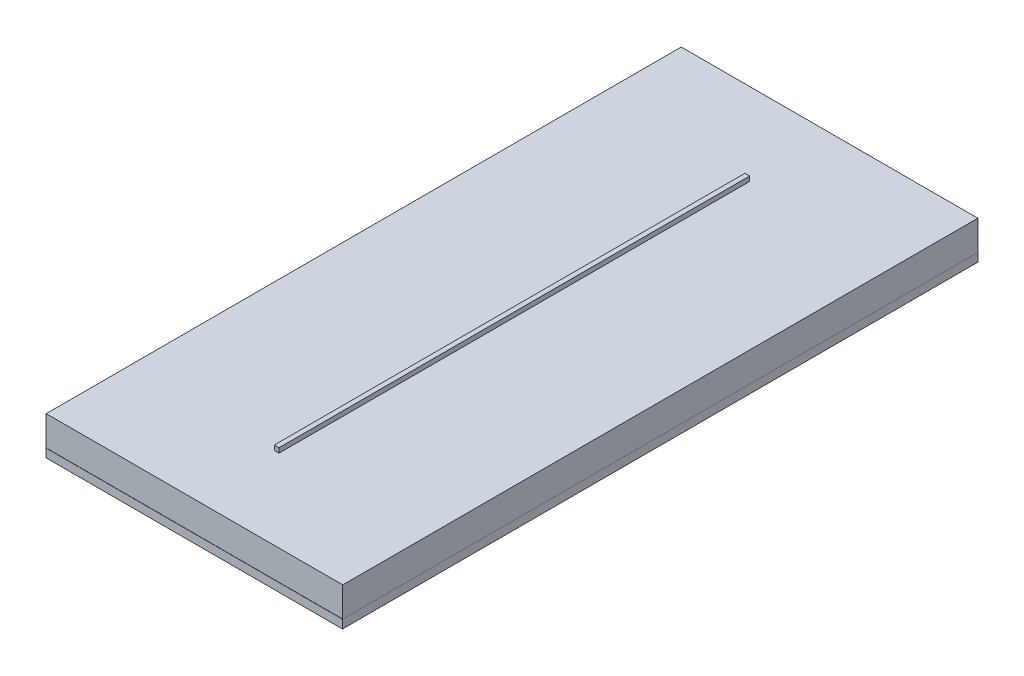
ISO-10303-21;
HEADER;
FILE_DESCRIPTION(('STEP AP214'),'2;1');
FILE_NAME('part.step','',(''),(''),'','','');
FILE_SCHEMA(('AUTOMOTIVE_DESIGN { 1 0 10303 214 1 1 1 1 }'));
ENDSEC;
DATA;
#1=APPLICATION_CONTEXT('core data for automotive mechanical design processes');
#2=APPLICATION_PROTOCOL_DEFINITION('international standard','automotive_design',2000,#1);
#3=PRODUCT_CONTEXT('',#1,'mechanical');
#4=PRODUCT('Part','Part','',(#3));
#5=PRODUCT_RELATED_PRODUCT_CATEGORY('part','',(#4));
#6=PRODUCT_DEFINITION_FORMATION('','',#4);
#7=PRODUCT_DEFINITION_CONTEXT('part definition',#1,'design');
#8=PRODUCT_DEFINITION('design','',#6,#7);
#9=PRODUCT_DEFINITION_SHAPE('','',#8);
#10=(LENGTH_UNIT() NAMED_UNIT(*) SI_UNIT(.MILLI.,.METRE.));
#11=(NAMED_UNIT(*) PLANE_ANGLE_UNIT() SI_UNIT($,.RADIAN.));
#12=(NAMED_UNIT(*) SI_UNIT($,.STERADIAN.) SOLID_ANGLE_UNIT());
#13=UNCERTAINTY_MEASURE_WITH_UNIT(LENGTH_MEASURE(1.E-05),#10,'distance_accuracy_value','');
#14=(GEOMETRIC_REPRESENTATION_CONTEXT(3) GLOBAL_UNCERTAINTY_ASSIGNED_CONTEXT((#13)) GLOBAL_UNIT_ASSIGNED_CONTEXT((#10,
#11,#12)) REPRESENTATION_CONTEXT('',''));
#15=CARTESIAN_POINT('',(0.,0.,0.));
#16=DIRECTION('',(0.,0.,1.));
#17=DIRECTION('',(1.,0.,0.));
#18=AXIS2_PLACEMENT_3D('',#15,#16,#17);
#19=CARTESIAN_POINT('',(0.,6.52477580255802,0.));
#20=DIRECTION('',(0.,1.,0.));
#21=DIRECTION('',(0.,0.,1.));
#22=AXIS2_PLACEMENT_3D('',#19,#20,#21);
#23=PLANE('',#22);
#24=DIRECTION('',(0.,0.,-1.));
#25=VECTOR('',#24,1.);
#26=CARTESIAN_POINT('',(15.75,6.52477580255802,-33.7275));
#27=LINE('',#26,#25);
#28=CARTESIAN_POINT('',(15.75,6.52477580255802,33.7275));
#29=VERTEX_POINT('',#28);
#30=CARTESIAN_POINT('',(15.75,6.52477580255802,-33.7275));
#31=VERTEX_POINT('',#30);
#32=EDGE_CURVE('E171',#29,#31,#27,.T.);
#33=ORIENTED_EDGE('',*,*,#32,.T.);
#34=DIRECTION('',(-1.,0.,0.));
#35=VECTOR('',#34,1.);
#36=CARTESIAN_POINT('',(-15.75,6.52477580255802,-33.7275));
#37=LINE('',#36,#35);
#38=CARTESIAN_POINT('',(-15.75,6.52477580255802,-33.7275));
#39=VERTEX_POINT('',#38);
#40=EDGE_CURVE('E174',#31,#39,#37,.T.);
#41=ORIENTED_EDGE('',*,*,#40,.T.);
#42=DIRECTION('',(0.,0.,1.));
#43=VECTOR('',#42,1.);
#44=CARTESIAN_POINT('',(-15.75,6.52477580255802,-33.7275));
#45=LINE('',#44,#43);
#46=CARTESIAN_POINT('',(-15.75,6.52477580255802,33.7275));
#47=VERTEX_POINT('',#46);
#48=EDGE_CURVE('E176',#39,#47,#45,.T.);
#49=ORIENTED_EDGE('',*,*,#48,.T.);
#50=DIRECTION('',(1.,0.,0.));
#51=VECTOR('',#50,1.);
#52=CARTESIAN_POINT('',(-15.75,6.52477580255802,33.7275));
#53=LINE('',#52,#51);
#54=EDGE_CURVE('E178',#47,#29,#53,.T.);
#55=ORIENTED_EDGE('',*,*,#54,.T.);
#56=EDGE_LOOP('',(#33,#41,#49,#55));
#57=FACE_BOUND('',#56,.T.);
#58=DIRECTION('',(1.,0.,0.));
#59=VECTOR('',#58,1.);
#60=CARTESIAN_POINT('',(0.25,6.52477580255802,25.));
#61=LINE('',#60,#59);
#62=CARTESIAN_POINT('',(-0.25,6.52477580255802,25.));
#63=VERTEX_POINT('',#62);
#64=CARTESIAN_POINT('',(0.25,6.52477580255802,25.));
#65=VERTEX_POINT('',#64);
#66=EDGE_CURVE('E428',#63,#65,#61,.T.);
#67=ORIENTED_EDGE('',*,*,#66,.F.);
#68=DIRECTION('',(0.,0.,1.));
#69=VECTOR('',#68,1.);
#70=CARTESIAN_POINT('',(-0.25,6.52477580255802,25.));
#71=LINE('',#70,#69);
#72=CARTESIAN_POINT('',(-0.25,6.52477580255802,-25.));
#73=VERTEX_POINT('',#72);
#74=EDGE_CURVE('E161',#73,#63,#71,.T.);
#75=ORIENTED_EDGE('',*,*,#74,.F.);
#76=DIRECTION('',(-1.,0.,0.));
#77=VECTOR('',#76,1.);
#78=CARTESIAN_POINT('',(0.25,6.52477580255802,-25.));
#79=LINE('',#78,#77);
#80=CARTESIAN_POINT('',(0.25,6.52477580255802,-25.));
#81=VERTEX_POINT('',#80);
#82=EDGE_CURVE('E157',#81,#73,#79,.T.);
#83=ORIENTED_EDGE('',*,*,#82,.F.);
#84=DIRECTION('',(0.,0.,-1.));
#85=VECTOR('',#84,1.);
#86=CARTESIAN_POINT('',(0.25,6.52477580255802,25.));
#87=LINE('',#86,#85);
#88=EDGE_CURVE('E425',#65,#81,#87,.T.);
#89=ORIENTED_EDGE('',*,*,#88,.F.);
#90=EDGE_LOOP('',(#67,#75,#83,#89));
#91=FACE_BOUND('',#90,.T.);
#92=ADVANCED_FACE('F34',(#57,#91),#23,.T.);
#93=CARTESIAN_POINT('',(0.,3.37477580255802,0.));
#94=DIRECTION('',(0.,1.,0.));
#95=DIRECTION('',(0.,0.,1.));
#96=AXIS2_PLACEMENT_3D('',#93,#94,#95);
#97=PLANE('',#96);
#98=DIRECTION('',(1.,0.,0.));
#99=VECTOR('',#98,1.);
#100=CARTESIAN_POINT('',(-15.75,3.37477580255802,33.7275));
#101=LINE('',#100,#99);
#102=CARTESIAN_POINT('',(-15.74775,3.37477580255802,33.7275));
#103=VERTEX_POINT('',#102);
#104=CARTESIAN_POINT('',(15.74775,3.37477580255802,33.7275));
#105=VERTEX_POINT('',#104);
#106=EDGE_CURVE('E11',#103,#105,#101,.T.);
#107=ORIENTED_EDGE('',*,*,#106,.F.);
#108=DIRECTION('',(0.,0.,1.));
#109=VECTOR('',#108,1.);
#110=CARTESIAN_POINT('',(-15.74775,3.37477580255802,-33.75));
#111=LINE('',#110,#109);
#112=CARTESIAN_POINT('',(-15.74775,3.37477580255802,33.75));
#113=VERTEX_POINT('',#112);
#114=EDGE_CURVE('E205',#103,#113,#111,.T.);
#115=ORIENTED_EDGE('',*,*,#114,.T.);
#116=DIRECTION('',(1.,0.,0.));
#117=VECTOR('',#116,1.);
#118=CARTESIAN_POINT('',(-15.74775,3.37477580255802,33.75));
#119=LINE('',#118,#117);
#120=CARTESIAN_POINT('',(15.74775,3.37477580255802,33.75));
#121=VERTEX_POINT('',#120);
#122=EDGE_CURVE('E208',#113,#121,#119,.T.);
#123=ORIENTED_EDGE('',*,*,#122,.T.);
#124=DIRECTION('',(0.,0.,-1.));
#125=VECTOR('',#124,1.);
#126=CARTESIAN_POINT('',(15.74775,3.37477580255802,-33.75));
#127=LINE('',#126,#125);
#128=EDGE_CURVE('E199',#121,#105,#127,.T.);
#129=ORIENTED_EDGE('',*,*,#128,.T.);
#130=EDGE_LOOP('',(#107,#115,#123,#129));
#131=FACE_BOUND('',#130,.T.);
#132=ADVANCED_FACE('F280',(#131),#97,.T.);
#133=CARTESIAN_POINT('',(15.74775,3.37477580255802,-33.75));
#134=DIRECTION('',(-1.,0.,0.));
#135=DIRECTION('',(0.,0.,1.));
#136=AXIS2_PLACEMENT_3D('',#133,#134,#135);
#137=PLANE('',#136);
#138=DIRECTION('',(0.,0.,-1.));
#139=VECTOR('',#138,1.);
#140=CARTESIAN_POINT('',(15.74775,2.47477580255802,-33.75));
#141=LINE('',#140,#139);
#142=CARTESIAN_POINT('',(15.74775,2.47477580255802,33.75));
#143=VERTEX_POINT('',#142);
#144=CARTESIAN_POINT('',(15.74775,2.47477580255802,-33.75));
#145=VERTEX_POINT('',#144);
#146=EDGE_CURVE('E198',#143,#145,#141,.T.);
#147=ORIENTED_EDGE('',*,*,#146,.T.);
#148=DIRECTION('',(0.,-1.,0.));
#149=VECTOR('',#148,1.);
#150=CARTESIAN_POINT('',(15.74775,3.37477580255802,-33.75));
#151=LINE('',#150,#149);
#152=CARTESIAN_POINT('',(15.74775,3.37477580255802,-33.75));
#153=VERTEX_POINT('',#152);
#154=EDGE_CURVE('E38',#153,#145,#151,.T.);
#155=ORIENTED_EDGE('',*,*,#154,.F.);
#156=CARTESIAN_POINT('',(15.74775,3.37477580255802,-33.7275));
#157=VERTEX_POINT('',#156);
#158=EDGE_CURVE('E203',#157,#153,#127,.T.);
#159=ORIENTED_EDGE('',*,*,#158,.F.);
#160=EDGE_CURVE('E202',#105,#157,#127,.T.);
#161=ORIENTED_EDGE('',*,*,#160,.F.);
#162=ORIENTED_EDGE('',*,*,#128,.F.);
#163=DIRECTION('',(0.,-1.,0.));
#164=VECTOR('',#163,1.);
#165=CARTESIAN_POINT('',(15.74775,3.37477580255802,33.75));
#166=LINE('',#165,#164);
#167=EDGE_CURVE('E211',#121,#143,#166,.T.);
#168=ORIENTED_EDGE('',*,*,#167,.T.);
#169=EDGE_LOOP('',(#147,#155,#159,#161,#162,#168));
#170=FACE_BOUND('',#169,.T.);
#171=ADVANCED_FACE('F36',(#170),#137,.F.);
#172=CARTESIAN_POINT('',(-15.74775,3.37477580255802,-33.75));
#173=DIRECTION('',(0.,0.,1.));
#174=DIRECTION('',(1.,0.,0.));
#175=AXIS2_PLACEMENT_3D('',#172,#173,#174);
#176=PLANE('',#175);
#177=DIRECTION('',(-1.,0.,0.));
#178=VECTOR('',#177,1.);
#179=CARTESIAN_POINT('',(-15.74775,2.47477580255802,-33.75));
#180=LINE('',#179,#178);
#181=CARTESIAN_POINT('',(-15.74775,2.47477580255802,-33.75));
#182=VERTEX_POINT('',#181);
#183=EDGE_CURVE('E214',#145,#182,#180,.T.);
#184=ORIENTED_EDGE('',*,*,#183,.T.);
#185=DIRECTION('',(0.,-1.,0.));
#186=VECTOR('',#185,1.);
#187=CARTESIAN_POINT('',(-15.74775,3.37477580255802,-33.75));
#188=LINE('',#187,#186);
#189=CARTESIAN_POINT('',(-15.74775,3.37477580255802,-33.75));
#190=VERTEX_POINT('',#189);
#191=EDGE_CURVE('E224',#190,#182,#188,.T.);
#192=ORIENTED_EDGE('',*,*,#191,.F.);
#193=DIRECTION('',(-1.,0.,0.));
#194=VECTOR('',#193,1.);
#195=CARTESIAN_POINT('',(-15.74775,3.37477580255802,-33.75));
#196=LINE('',#195,#194);
#197=EDGE_CURVE('E201',#153,#190,#196,.T.);
#198=ORIENTED_EDGE('',*,*,#197,.F.);
#199=ORIENTED_EDGE('',*,*,#154,.T.);
#200=EDGE_LOOP('',(#184,#192,#198,#199));
#201=FACE_BOUND('',#200,.T.);
#202=ADVANCED_FACE('F269',(#201),#176,.F.);
#203=CARTESIAN_POINT('',(-15.74775,3.37477580255802,-33.75));
#204=DIRECTION('',(1.,0.,0.));
#205=DIRECTION('',(0.,0.,-1.));
#206=AXIS2_PLACEMENT_3D('',#203,#204,#205);
#207=PLANE('',#206);
#208=DIRECTION('',(0.,0.,1.));
#209=VECTOR('',#208,1.);
#210=CARTESIAN_POINT('',(-15.74775,2.47477580255802,-33.75));
#211=LINE('',#210,#209);
#212=CARTESIAN_POINT('',(-15.74775,2.47477580255802,33.75));
#213=VERTEX_POINT('',#212);
#214=EDGE_CURVE('E216',#182,#213,#211,.T.);
#215=ORIENTED_EDGE('',*,*,#214,.T.);
#216=DIRECTION('',(0.,-1.,0.));
#217=VECTOR('',#216,1.);
#218=CARTESIAN_POINT('',(-15.74775,3.37477580255802,33.75));
#219=LINE('',#218,#217);
#220=EDGE_CURVE('E222',#113,#213,#219,.T.);
#221=ORIENTED_EDGE('',*,*,#220,.F.);
#222=ORIENTED_EDGE('',*,*,#114,.F.);
#223=CARTESIAN_POINT('',(-15.74775,3.37477580255802,-33.7275));
#224=VERTEX_POINT('',#223);
#225=EDGE_CURVE('E209',#224,#103,#111,.T.);
#226=ORIENTED_EDGE('',*,*,#225,.F.);
#227=EDGE_CURVE('E206',#190,#224,#111,.T.);
#228=ORIENTED_EDGE('',*,*,#227,.F.);
#229=ORIENTED_EDGE('',*,*,#191,.T.);
#230=EDGE_LOOP('',(#215,#221,#222,#226,#228,#229));
#231=FACE_BOUND('',#230,.T.);
#232=ADVANCED_FACE('F276',(#231),#207,.F.);
#233=CARTESIAN_POINT('',(-15.74775,3.37477580255802,33.75));
#234=DIRECTION('',(0.,0.,-1.));
#235=DIRECTION('',(-1.,0.,0.));
#236=AXIS2_PLACEMENT_3D('',#233,#234,#235);
#237=PLANE('',#236);
#238=DIRECTION('',(1.,0.,0.));
#239=VECTOR('',#238,1.);
#240=CARTESIAN_POINT('',(-15.74775,2.47477580255802,33.75));
#241=LINE('',#240,#239);
#242=EDGE_CURVE('E218',#213,#143,#241,.T.);
#243=ORIENTED_EDGE('',*,*,#242,.T.);
#244=ORIENTED_EDGE('',*,*,#167,.F.);
#245=ORIENTED_EDGE('',*,*,#122,.F.);
#246=ORIENTED_EDGE('',*,*,#220,.T.);
#247=EDGE_LOOP('',(#243,#244,#245,#246));
#248=FACE_BOUND('',#247,.T.);
#249=ADVANCED_FACE('F279',(#248),#237,.F.);
#250=DIRECTION('',(-1.,0.,0.));
#251=VECTOR('',#250,1.);
#252=CARTESIAN_POINT('',(-15.75,3.37477580255802,-33.7275));
#253=LINE('',#252,#251);
#254=EDGE_CURVE('E43',#157,#224,#253,.T.);
#255=ORIENTED_EDGE('',*,*,#254,.F.);
#256=ORIENTED_EDGE('',*,*,#158,.T.);
#257=ORIENTED_EDGE('',*,*,#197,.T.);
#258=ORIENTED_EDGE('',*,*,#227,.T.);
#259=EDGE_LOOP('',(#255,#256,#257,#258));
#260=FACE_BOUND('',#259,.T.);
#261=ADVANCED_FACE('F268',(#260),#97,.T.);
#262=CARTESIAN_POINT('',(0.,2.47477580255802,0.));
#263=DIRECTION('',(0.,1.,0.));
#264=DIRECTION('',(0.,0.,1.));
#265=AXIS2_PLACEMENT_3D('',#262,#263,#264);
#266=PLANE('',#265);
#267=ORIENTED_EDGE('',*,*,#146,.F.);
#268=ORIENTED_EDGE('',*,*,#242,.F.);
#269=ORIENTED_EDGE('',*,*,#214,.F.);
#270=ORIENTED_EDGE('',*,*,#183,.F.);
#271=EDGE_LOOP('',(#267,#268,#269,#270));
#272=FACE_BOUND('',#271,.T.);
#273=ADVANCED_FACE('F274',(#272),#266,.F.);
#274=CARTESIAN_POINT('',(0.,3.37477580255802,0.));
#275=DIRECTION('',(0.,1.,0.));
#276=DIRECTION('',(0.,0.,1.));
#277=AXIS2_PLACEMENT_3D('',#274,#275,#276);
#278=PLANE('',#277);
#279=CARTESIAN_POINT('',(15.75,3.37477580255802,33.7275));
#280=VERTEX_POINT('',#279);
#281=EDGE_CURVE('E46',#105,#280,#101,.T.);
#282=ORIENTED_EDGE('',*,*,#281,.F.);
#283=ORIENTED_EDGE('',*,*,#160,.T.);
#284=CARTESIAN_POINT('',(15.75,3.37477580255802,-33.7275));
#285=VERTEX_POINT('',#284);
#286=EDGE_CURVE('E181',#285,#157,#253,.T.);
#287=ORIENTED_EDGE('',*,*,#286,.F.);
#288=DIRECTION('',(0.,0.,-1.));
#289=VECTOR('',#288,1.);
#290=CARTESIAN_POINT('',(15.75,3.37477580255802,-33.7275));
#291=LINE('',#290,#289);
#292=EDGE_CURVE('E163',#280,#285,#291,.T.);
#293=ORIENTED_EDGE('',*,*,#292,.F.);
#294=EDGE_LOOP('',(#282,#283,#287,#293));
#295=FACE_BOUND('',#294,.T.);
#296=ADVANCED_FACE('F262',(#295),#278,.F.);
#297=CARTESIAN_POINT('',(-15.75,3.37477580255802,-33.7275));
#298=VERTEX_POINT('',#297);
#299=EDGE_CURVE('E166',#224,#298,#253,.T.);
#300=ORIENTED_EDGE('',*,*,#299,.F.);
#301=ORIENTED_EDGE('',*,*,#225,.T.);
#302=CARTESIAN_POINT('',(-15.75,3.37477580255802,33.7275));
#303=VERTEX_POINT('',#302);
#304=EDGE_CURVE('E45',#303,#103,#101,.T.);
#305=ORIENTED_EDGE('',*,*,#304,.F.);
#306=DIRECTION('',(0.,0.,1.));
#307=VECTOR('',#306,1.);
#308=CARTESIAN_POINT('',(-15.75,3.37477580255802,-33.7275));
#309=LINE('',#308,#307);
#310=EDGE_CURVE('E184',#298,#303,#309,.T.);
#311=ORIENTED_EDGE('',*,*,#310,.F.);
#312=EDGE_LOOP('',(#300,#301,#305,#311));
#313=FACE_BOUND('',#312,.T.);
#314=ADVANCED_FACE('F247',(#313),#278,.F.);
#315=CARTESIAN_POINT('',(15.75,6.52477580255802,-33.7275));
#316=DIRECTION('',(-1.,0.,0.));
#317=DIRECTION('',(0.,0.,1.));
#318=AXIS2_PLACEMENT_3D('',#315,#316,#317);
#319=PLANE('',#318);
#320=ORIENTED_EDGE('',*,*,#292,.T.);
#321=DIRECTION('',(0.,-1.,0.));
#322=VECTOR('',#321,1.);
#323=CARTESIAN_POINT('',(15.75,6.52477580255802,-33.7275));
#324=LINE('',#323,#322);
#325=EDGE_CURVE('E195',#31,#285,#324,.T.);
#326=ORIENTED_EDGE('',*,*,#325,.F.);
#327=ORIENTED_EDGE('',*,*,#32,.F.);
#328=DIRECTION('',(0.,-1.,0.));
#329=VECTOR('',#328,1.);
#330=CARTESIAN_POINT('',(15.75,6.52477580255802,33.7275));
#331=LINE('',#330,#329);
#332=EDGE_CURVE('E179',#29,#280,#331,.T.);
#333=ORIENTED_EDGE('',*,*,#332,.T.);
#334=EDGE_LOOP('',(#320,#326,#327,#333));
#335=FACE_BOUND('',#334,.T.);
#336=ADVANCED_FACE('F259',(#335),#319,.F.);
#337=CARTESIAN_POINT('',(-15.75,6.52477580255802,-33.7275));
#338=DIRECTION('',(0.,0.,1.));
#339=DIRECTION('',(1.,0.,0.));
#340=AXIS2_PLACEMENT_3D('',#337,#338,#339);
#341=PLANE('',#340);
#342=ORIENTED_EDGE('',*,*,#286,.T.);
#343=ORIENTED_EDGE('',*,*,#254,.T.);
#344=ORIENTED_EDGE('',*,*,#299,.T.);
#345=DIRECTION('',(0.,-1.,0.));
#346=VECTOR('',#345,1.);
#347=CARTESIAN_POINT('',(-15.75,6.52477580255802,-33.7275));
#348=LINE('',#347,#346);
#349=EDGE_CURVE('E192',#39,#298,#348,.T.);
#350=ORIENTED_EDGE('',*,*,#349,.F.);
#351=ORIENTED_EDGE('',*,*,#40,.F.);
#352=ORIENTED_EDGE('',*,*,#325,.T.);
#353=EDGE_LOOP('',(#342,#343,#344,#350,#351,#352));
#354=FACE_BOUND('',#353,.T.);
#355=ADVANCED_FACE('F238',(#354),#341,.F.);
#356=CARTESIAN_POINT('',(-15.75,6.52477580255802,-33.7275));
#357=DIRECTION('',(1.,0.,0.));
#358=DIRECTION('',(0.,0.,-1.));
#359=AXIS2_PLACEMENT_3D('',#356,#357,#358);
#360=PLANE('',#359);
#361=ORIENTED_EDGE('',*,*,#310,.T.);
#362=DIRECTION('',(0.,-1.,0.));
#363=VECTOR('',#362,1.);
#364=CARTESIAN_POINT('',(-15.75,6.52477580255802,33.7275));
#365=LINE('',#364,#363);
#366=EDGE_CURVE('E189',#47,#303,#365,.T.);
#367=ORIENTED_EDGE('',*,*,#366,.F.);
#368=ORIENTED_EDGE('',*,*,#48,.F.);
#369=ORIENTED_EDGE('',*,*,#349,.T.);
#370=EDGE_LOOP('',(#361,#367,#368,#369));
#371=FACE_BOUND('',#370,.T.);
#372=ADVANCED_FACE('F244',(#371),#360,.F.);
#373=CARTESIAN_POINT('',(-15.75,6.52477580255802,33.7275));
#374=DIRECTION('',(0.,0.,-1.));
#375=DIRECTION('',(-1.,0.,0.));
#376=AXIS2_PLACEMENT_3D('',#373,#374,#375);
#377=PLANE('',#376);
#378=ORIENTED_EDGE('',*,*,#304,.T.);
#379=ORIENTED_EDGE('',*,*,#106,.T.);
#380=ORIENTED_EDGE('',*,*,#281,.T.);
#381=ORIENTED_EDGE('',*,*,#332,.F.);
#382=ORIENTED_EDGE('',*,*,#54,.F.);
#383=ORIENTED_EDGE('',*,*,#366,.T.);
#384=EDGE_LOOP('',(#378,#379,#380,#381,#382,#383));
#385=FACE_BOUND('',#384,.T.);
#386=ADVANCED_FACE('F250',(#385),#377,.F.);
#387=CARTESIAN_POINT('',(-0.25,7.02477580255802,25.));
#388=DIRECTION('',(1.,0.,0.));
#389=DIRECTION('',(0.,0.,-1.));
#390=AXIS2_PLACEMENT_3D('',#387,#388,#389);
#391=PLANE('',#390);
#392=ORIENTED_EDGE('',*,*,#74,.T.);
#393=DIRECTION('',(0.,-1.,0.));
#394=VECTOR('',#393,1.);
#395=CARTESIAN_POINT('',(-0.25,7.02477580255802,25.));
#396=LINE('',#395,#394);
#397=CARTESIAN_POINT('',(-0.25,7.02477580255802,25.));
#398=VERTEX_POINT('',#397);
#399=EDGE_CURVE('E142',#398,#63,#396,.T.);
#400=ORIENTED_EDGE('',*,*,#399,.F.);
#401=DIRECTION('',(0.,0.,1.));
#402=VECTOR('',#401,1.);
#403=CARTESIAN_POINT('',(-0.25,7.02477580255802,25.));
#404=LINE('',#403,#402);
#405=CARTESIAN_POINT('',(-0.25,7.02477580255802,-25.));
#406=VERTEX_POINT('',#405);
#407=EDGE_CURVE('E149',#406,#398,#404,.T.);
#408=ORIENTED_EDGE('',*,*,#407,.F.);
#409=DIRECTION('',(0.,-1.,0.));
#410=VECTOR('',#409,1.);
#411=CARTESIAN_POINT('',(-0.25,7.02477580255802,-25.));
#412=LINE('',#411,#410);
#413=EDGE_CURVE('E423',#406,#73,#412,.T.);
#414=ORIENTED_EDGE('',*,*,#413,.T.);
#415=EDGE_LOOP('',(#392,#400,#408,#414));
#416=FACE_BOUND('',#415,.T.);
#417=ADVANCED_FACE('F159',(#416),#391,.F.);
#418=CARTESIAN_POINT('',(0.25,7.02477580255802,25.));
#419=DIRECTION('',(0.,0.,-1.));
#420=DIRECTION('',(-1.,0.,0.));
#421=AXIS2_PLACEMENT_3D('',#418,#419,#420);
#422=PLANE('',#421);
#423=ORIENTED_EDGE('',*,*,#66,.T.);
#424=DIRECTION('',(0.,-1.,0.));
#425=VECTOR('',#424,1.);
#426=CARTESIAN_POINT('',(0.25,7.02477580255802,25.));
#427=LINE('',#426,#425);
#428=CARTESIAN_POINT('',(0.25,7.02477580255802,25.));
#429=VERTEX_POINT('',#428);
#430=EDGE_CURVE('E145',#429,#65,#427,.T.);
#431=ORIENTED_EDGE('',*,*,#430,.F.);
#432=DIRECTION('',(1.,0.,0.));
#433=VECTOR('',#432,1.);
#434=CARTESIAN_POINT('',(0.25,7.02477580255802,25.));
#435=LINE('',#434,#433);
#436=EDGE_CURVE('E138',#398,#429,#435,.T.);
#437=ORIENTED_EDGE('',*,*,#436,.F.);
#438=ORIENTED_EDGE('',*,*,#399,.T.);
#439=EDGE_LOOP('',(#423,#431,#437,#438));
#440=FACE_BOUND('',#439,.T.);
#441=ADVANCED_FACE('F140',(#440),#422,.F.);
#442=CARTESIAN_POINT('',(0.25,7.02477580255802,25.));
#443=DIRECTION('',(-1.,0.,0.));
#444=DIRECTION('',(0.,0.,1.));
#445=AXIS2_PLACEMENT_3D('',#442,#443,#444);
#446=PLANE('',#445);
#447=ORIENTED_EDGE('',*,*,#88,.T.);
#448=DIRECTION('',(0.,-1.,0.));
#449=VECTOR('',#448,1.);
#450=CARTESIAN_POINT('',(0.25,7.02477580255802,-25.));
#451=LINE('',#450,#449);
#452=CARTESIAN_POINT('',(0.25,7.02477580255802,-25.));
#453=VERTEX_POINT('',#452);
#454=EDGE_CURVE('E53',#453,#81,#451,.T.);
#455=ORIENTED_EDGE('',*,*,#454,.F.);
#456=DIRECTION('',(0.,0.,-1.));
#457=VECTOR('',#456,1.);
#458=CARTESIAN_POINT('',(0.25,7.02477580255802,25.));
#459=LINE('',#458,#457);
#460=EDGE_CURVE('E148',#429,#453,#459,.T.);
#461=ORIENTED_EDGE('',*,*,#460,.F.);
#462=ORIENTED_EDGE('',*,*,#430,.T.);
#463=EDGE_LOOP('',(#447,#455,#461,#462));
#464=FACE_BOUND('',#463,.T.);
#465=ADVANCED_FACE('F392',(#464),#446,.F.);
#466=CARTESIAN_POINT('',(0.25,7.02477580255802,-25.));
#467=DIRECTION('',(0.,0.,1.));
#468=DIRECTION('',(1.,0.,0.));
#469=AXIS2_PLACEMENT_3D('',#466,#467,#468);
#470=PLANE('',#469);
#471=ORIENTED_EDGE('',*,*,#82,.T.);
#472=ORIENTED_EDGE('',*,*,#413,.F.);
#473=DIRECTION('',(-1.,0.,0.));
#474=VECTOR('',#473,1.);
#475=CARTESIAN_POINT('',(0.25,7.02477580255802,-25.));
#476=LINE('',#475,#474);
#477=EDGE_CURVE('E153',#453,#406,#476,.T.);
#478=ORIENTED_EDGE('',*,*,#477,.F.);
#479=ORIENTED_EDGE('',*,*,#454,.T.);
#480=EDGE_LOOP('',(#471,#472,#478,#479));
#481=FACE_BOUND('',#480,.T.);
#482=ADVANCED_FACE('F401',(#481),#470,.F.);
#483=CARTESIAN_POINT('',(0.,7.02477580255802,0.));
#484=DIRECTION('',(0.,1.,0.));
#485=DIRECTION('',(0.,0.,1.));
#486=AXIS2_PLACEMENT_3D('',#483,#484,#485);
#487=PLANE('',#486);
#488=ORIENTED_EDGE('',*,*,#407,.T.);
#489=ORIENTED_EDGE('',*,*,#436,.T.);
#490=ORIENTED_EDGE('',*,*,#460,.T.);
#491=ORIENTED_EDGE('',*,*,#477,.T.);
#492=EDGE_LOOP('',(#488,#489,#490,#491));
#493=FACE_BOUND('',#492,.T.);
#494=ADVANCED_FACE('F152',(#493),#487,.T.);
#495=CLOSED_SHELL('',(#92,#132,#171,#202,#232,#249,#261,#273,#296,#314,#336,#355,#372,#386,#417,
#441,#465,#482,#494));
#496=MANIFOLD_SOLID_BREP('B2',#495);
#497=ADVANCED_BREP_SHAPE_REPRESENTATION('',(#18,#496),#14);
#498=SHAPE_DEFINITION_REPRESENTATION(#9,#497);
ENDSEC;
END-ISO-10303-21;
